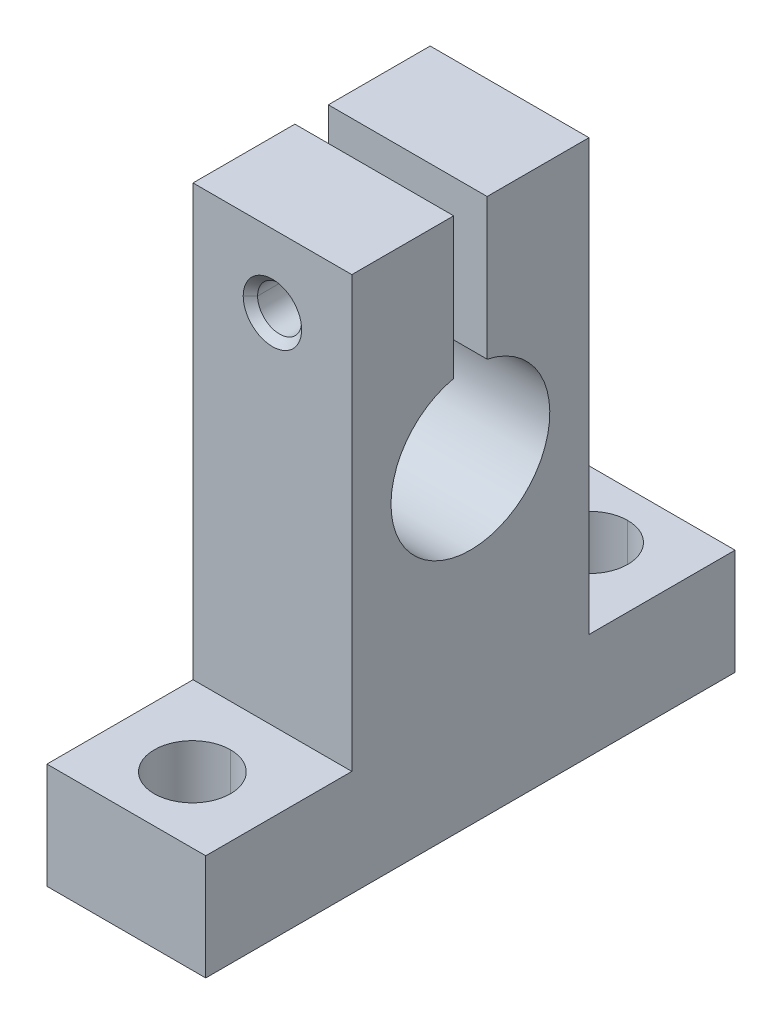
ISO-10303-21;
HEADER;
FILE_DESCRIPTION(('STEP AP214'),'2;1');
FILE_NAME('part.step','',(''),(''),'','','');
FILE_SCHEMA(('AUTOMOTIVE_DESIGN { 1 0 10303 214 1 1 1 1 }'));
ENDSEC;
DATA;
#1=APPLICATION_CONTEXT('core data for automotive mechanical design processes');
#2=APPLICATION_PROTOCOL_DEFINITION('international standard','automotive_design',2000,#1);
#3=PRODUCT_CONTEXT('',#1,'mechanical');
#4=PRODUCT('Part','Part','',(#3));
#5=PRODUCT_RELATED_PRODUCT_CATEGORY('part','',(#4));
#6=PRODUCT_DEFINITION_FORMATION('','',#4);
#7=PRODUCT_DEFINITION_CONTEXT('part definition',#1,'design');
#8=PRODUCT_DEFINITION('design','',#6,#7);
#9=PRODUCT_DEFINITION_SHAPE('','',#8);
#10=(LENGTH_UNIT() NAMED_UNIT(*) SI_UNIT(.MILLI.,.METRE.));
#11=(NAMED_UNIT(*) PLANE_ANGLE_UNIT() SI_UNIT($,.RADIAN.));
#12=(NAMED_UNIT(*) SI_UNIT($,.STERADIAN.) SOLID_ANGLE_UNIT());
#13=UNCERTAINTY_MEASURE_WITH_UNIT(LENGTH_MEASURE(1.E-05),#10,'distance_accuracy_value','');
#14=(GEOMETRIC_REPRESENTATION_CONTEXT(3) GLOBAL_UNCERTAINTY_ASSIGNED_CONTEXT((#13)) GLOBAL_UNIT_ASSIGNED_CONTEXT((#10,
#11,#12)) REPRESENTATION_CONTEXT('',''));
#15=CARTESIAN_POINT('',(0.,0.,0.));
#16=DIRECTION('',(0.,0.,1.));
#17=DIRECTION('',(1.,0.,0.));
#18=AXIS2_PLACEMENT_3D('',#15,#16,#17);
#19=CARTESIAN_POINT('',(4.7625,-12.7,15.875));
#20=DIRECTION('',(0.,0.,-1.));
#21=DIRECTION('',(-1.,0.,0.));
#22=AXIS2_PLACEMENT_3D('',#19,#20,#21);
#23=PLANE('',#22);
#24=DIRECTION('',(0.,-1.,0.));
#25=VECTOR('',#24,1.);
#26=CARTESIAN_POINT('',(-4.7625,-12.7,15.875));
#27=LINE('',#26,#25);
#28=CARTESIAN_POINT('',(-4.7625,-12.7,15.875));
#29=VERTEX_POINT('',#28);
#30=CARTESIAN_POINT('',(-4.7625,-19.05,15.875));
#31=VERTEX_POINT('',#30);
#32=EDGE_CURVE('E11',#29,#31,#27,.T.);
#33=ORIENTED_EDGE('',*,*,#32,.T.);
#34=DIRECTION('',(-1.,0.,0.));
#35=VECTOR('',#34,1.);
#36=CARTESIAN_POINT('',(4.7625,-19.05,15.875));
#37=LINE('',#36,#35);
#38=CARTESIAN_POINT('',(4.7625,-19.05,15.875));
#39=VERTEX_POINT('',#38);
#40=EDGE_CURVE('E25',#39,#31,#37,.T.);
#41=ORIENTED_EDGE('',*,*,#40,.F.);
#42=DIRECTION('',(0.,-1.,0.));
#43=VECTOR('',#42,1.);
#44=CARTESIAN_POINT('',(4.7625,-12.7,15.875));
#45=LINE('',#44,#43);
#46=CARTESIAN_POINT('',(4.7625,-12.7,15.875));
#47=VERTEX_POINT('',#46);
#48=EDGE_CURVE('E519',#47,#39,#45,.T.);
#49=ORIENTED_EDGE('',*,*,#48,.F.);
#50=DIRECTION('',(-1.,0.,0.));
#51=VECTOR('',#50,1.);
#52=CARTESIAN_POINT('',(4.7625,-12.7,15.875));
#53=LINE('',#52,#51);
#54=EDGE_CURVE('E515',#47,#29,#53,.T.);
#55=ORIENTED_EDGE('',*,*,#54,.T.);
#56=EDGE_LOOP('',(#33,#41,#49,#55));
#57=FACE_BOUND('',#56,.T.);
#58=ADVANCED_FACE('F17',(#57),#23,.F.);
#59=CARTESIAN_POINT('',(4.7625,-12.7,7.112));
#60=DIRECTION('',(0.,-1.,0.));
#61=DIRECTION('',(0.,0.,-1.));
#62=AXIS2_PLACEMENT_3D('',#59,#60,#61);
#63=PLANE('',#62);
#64=CARTESIAN_POINT('',(0.,-12.7,11.9126));
#65=DIRECTION('',(0.,1.,0.));
#66=DIRECTION('',(1.,0.,0.));
#67=AXIS2_PLACEMENT_3D('',#64,#65,#66);
#68=CIRCLE('',#67,2.286);
#69=CARTESIAN_POINT('',(0.,-12.7,9.6266));
#70=VERTEX_POINT('',#69);
#71=CARTESIAN_POINT('',(0.,-12.7,14.1986));
#72=VERTEX_POINT('',#71);
#73=EDGE_CURVE('E510',#70,#72,#68,.T.);
#74=ORIENTED_EDGE('',*,*,#73,.F.);
#75=CARTESIAN_POINT('',(0.,-12.7,11.9126));
#76=DIRECTION('',(0.,1.,0.));
#77=DIRECTION('',(0.,0.,1.));
#78=AXIS2_PLACEMENT_3D('',#75,#76,#77);
#79=CIRCLE('',#78,2.286);
#80=EDGE_CURVE('E505',#72,#70,#79,.T.);
#81=ORIENTED_EDGE('',*,*,#80,.F.);
#82=EDGE_LOOP('',(#74,#81));
#83=FACE_BOUND('',#82,.T.);
#84=DIRECTION('',(0.,0.,1.));
#85=VECTOR('',#84,1.);
#86=CARTESIAN_POINT('',(-4.7625,-12.7,7.112));
#87=LINE('',#86,#85);
#88=CARTESIAN_POINT('',(-4.7625,-12.7,7.112));
#89=VERTEX_POINT('',#88);
#90=EDGE_CURVE('E500',#89,#29,#87,.T.);
#91=ORIENTED_EDGE('',*,*,#90,.T.);
#92=ORIENTED_EDGE('',*,*,#54,.F.);
#93=DIRECTION('',(0.,0.,1.));
#94=VECTOR('',#93,1.);
#95=CARTESIAN_POINT('',(4.7625,-12.7,7.112));
#96=LINE('',#95,#94);
#97=CARTESIAN_POINT('',(4.7625,-12.7,7.112));
#98=VERTEX_POINT('',#97);
#99=EDGE_CURVE('E495',#98,#47,#96,.T.);
#100=ORIENTED_EDGE('',*,*,#99,.F.);
#101=DIRECTION('',(-1.,0.,0.));
#102=VECTOR('',#101,1.);
#103=CARTESIAN_POINT('',(4.7625,-12.7,7.112));
#104=LINE('',#103,#102);
#105=EDGE_CURVE('E491',#98,#89,#104,.T.);
#106=ORIENTED_EDGE('',*,*,#105,.T.);
#107=EDGE_LOOP('',(#91,#92,#100,#106));
#108=FACE_BOUND('',#107,.T.);
#109=ADVANCED_FACE('F537',(#83,#108),#63,.F.);
#110=CARTESIAN_POINT('',(4.7625,13.1064,7.112));
#111=DIRECTION('',(0.,0.,-1.));
#112=DIRECTION('',(-1.,0.,0.));
#113=AXIS2_PLACEMENT_3D('',#110,#111,#112);
#114=PLANE('',#113);
#115=CARTESIAN_POINT('',(0.,8.7376,7.112));
#116=DIRECTION('',(0.,0.,-1.));
#117=DIRECTION('',(-1.,0.,0.));
#118=AXIS2_PLACEMENT_3D('',#115,#116,#117);
#119=CIRCLE('',#118,1.7526);
#120=CARTESIAN_POINT('',(-1.7526,8.7376,7.112));
#121=VERTEX_POINT('',#120);
#122=CARTESIAN_POINT('',(1.7526,8.7376,7.112));
#123=VERTEX_POINT('',#122);
#124=EDGE_CURVE('E487',#121,#123,#119,.T.);
#125=ORIENTED_EDGE('',*,*,#124,.T.);
#126=CARTESIAN_POINT('',(0.,8.7376,7.112));
#127=DIRECTION('',(0.,0.,-1.));
#128=DIRECTION('',(-1.,0.,0.));
#129=AXIS2_PLACEMENT_3D('',#126,#127,#128);
#130=CIRCLE('',#129,1.7526);
#131=EDGE_CURVE('E204',#123,#121,#130,.T.);
#132=ORIENTED_EDGE('',*,*,#131,.T.);
#133=EDGE_LOOP('',(#125,#132));
#134=FACE_BOUND('',#133,.T.);
#135=DIRECTION('',(0.,-1.,0.));
#136=VECTOR('',#135,1.);
#137=CARTESIAN_POINT('',(-4.7625,13.1064,7.112));
#138=LINE('',#137,#136);
#139=CARTESIAN_POINT('',(-4.7625,13.1064,7.112));
#140=VERTEX_POINT('',#139);
#141=EDGE_CURVE('E479',#140,#89,#138,.T.);
#142=ORIENTED_EDGE('',*,*,#141,.T.);
#143=ORIENTED_EDGE('',*,*,#105,.F.);
#144=DIRECTION('',(0.,-1.,0.));
#145=VECTOR('',#144,1.);
#146=CARTESIAN_POINT('',(4.7625,13.1064,7.112));
#147=LINE('',#146,#145);
#148=CARTESIAN_POINT('',(4.7625,13.1064,7.112));
#149=VERTEX_POINT('',#148);
#150=EDGE_CURVE('E474',#149,#98,#147,.T.);
#151=ORIENTED_EDGE('',*,*,#150,.F.);
#152=DIRECTION('',(-1.,0.,0.));
#153=VECTOR('',#152,1.);
#154=CARTESIAN_POINT('',(4.7625,13.1064,7.112));
#155=LINE('',#154,#153);
#156=EDGE_CURVE('E470',#149,#140,#155,.T.);
#157=ORIENTED_EDGE('',*,*,#156,.T.);
#158=EDGE_LOOP('',(#142,#143,#151,#157));
#159=FACE_BOUND('',#158,.T.);
#160=ADVANCED_FACE('F575',(#134,#159),#114,.F.);
#161=CARTESIAN_POINT('',(4.7625,13.1064,1.0033));
#162=DIRECTION('',(0.,-1.,0.));
#163=DIRECTION('',(0.,0.,-1.));
#164=AXIS2_PLACEMENT_3D('',#161,#162,#163);
#165=PLANE('',#164);
#166=DIRECTION('',(0.,0.,1.));
#167=VECTOR('',#166,1.);
#168=CARTESIAN_POINT('',(-4.7625,13.1064,1.0033));
#169=LINE('',#168,#167);
#170=CARTESIAN_POINT('',(-4.7625,13.1064,1.0033));
#171=VERTEX_POINT('',#170);
#172=EDGE_CURVE('E465',#171,#140,#169,.T.);
#173=ORIENTED_EDGE('',*,*,#172,.T.);
#174=ORIENTED_EDGE('',*,*,#156,.F.);
#175=DIRECTION('',(0.,0.,1.));
#176=VECTOR('',#175,1.);
#177=CARTESIAN_POINT('',(4.7625,13.1064,1.0033));
#178=LINE('',#177,#176);
#179=CARTESIAN_POINT('',(4.7625,13.1064,1.0033));
#180=VERTEX_POINT('',#179);
#181=EDGE_CURVE('E460',#180,#149,#178,.T.);
#182=ORIENTED_EDGE('',*,*,#181,.F.);
#183=DIRECTION('',(-1.,0.,0.));
#184=VECTOR('',#183,1.);
#185=CARTESIAN_POINT('',(4.7625,13.1064,1.0033));
#186=LINE('',#185,#184);
#187=EDGE_CURVE('E456',#180,#171,#186,.T.);
#188=ORIENTED_EDGE('',*,*,#187,.T.);
#189=EDGE_LOOP('',(#173,#174,#182,#188));
#190=FACE_BOUND('',#189,.T.);
#191=ADVANCED_FACE('F573',(#190),#165,.F.);
#192=CARTESIAN_POINT('',(4.7625,4.6556197611059,1.0033));
#193=DIRECTION('',(0.,0.,1.));
#194=DIRECTION('',(1.,0.,0.));
#195=AXIS2_PLACEMENT_3D('',#192,#193,#194);
#196=PLANE('',#195);
#197=CARTESIAN_POINT('',(0.,8.7376,1.0033));
#198=DIRECTION('',(0.,0.,-1.));
#199=DIRECTION('',(-1.,0.,0.));
#200=AXIS2_PLACEMENT_3D('',#197,#198,#199);
#201=CIRCLE('',#200,1.7526);
#202=CARTESIAN_POINT('',(1.7526,8.7376,1.0033));
#203=VERTEX_POINT('',#202);
#204=CARTESIAN_POINT('',(-1.7526,8.7376,1.0033));
#205=VERTEX_POINT('',#204);
#206=EDGE_CURVE('E451',#203,#205,#201,.T.);
#207=ORIENTED_EDGE('',*,*,#206,.F.);
#208=CARTESIAN_POINT('',(0.,8.7376,1.0033));
#209=DIRECTION('',(0.,0.,-1.));
#210=DIRECTION('',(-1.,0.,0.));
#211=AXIS2_PLACEMENT_3D('',#208,#209,#210);
#212=CIRCLE('',#211,1.7526);
#213=EDGE_CURVE('E446',#205,#203,#212,.T.);
#214=ORIENTED_EDGE('',*,*,#213,.F.);
#215=EDGE_LOOP('',(#207,#214));
#216=FACE_BOUND('',#215,.T.);
#217=DIRECTION('',(0.,1.,0.));
#218=VECTOR('',#217,1.);
#219=CARTESIAN_POINT('',(-4.7625,4.6556197611059,1.0033));
#220=LINE('',#219,#218);
#221=CARTESIAN_POINT('',(-4.7625,4.6556197611059,1.0033));
#222=VERTEX_POINT('',#221);
#223=EDGE_CURVE('E441',#222,#171,#220,.T.);
#224=ORIENTED_EDGE('',*,*,#223,.T.);
#225=ORIENTED_EDGE('',*,*,#187,.F.);
#226=DIRECTION('',(0.,1.,0.));
#227=VECTOR('',#226,1.);
#228=CARTESIAN_POINT('',(4.7625,4.6556197611059,1.0033));
#229=LINE('',#228,#227);
#230=CARTESIAN_POINT('',(4.7625,4.6556197611059,1.0033));
#231=VERTEX_POINT('',#230);
#232=EDGE_CURVE('E436',#231,#180,#229,.T.);
#233=ORIENTED_EDGE('',*,*,#232,.F.);
#234=DIRECTION('',(-1.,0.,0.));
#235=VECTOR('',#234,1.);
#236=CARTESIAN_POINT('',(4.7625,4.6556197611059,1.0033));
#237=LINE('',#236,#235);
#238=EDGE_CURVE('E432',#231,#222,#237,.T.);
#239=ORIENTED_EDGE('',*,*,#238,.T.);
#240=EDGE_LOOP('',(#224,#225,#233,#239));
#241=FACE_BOUND('',#240,.T.);
#242=ADVANCED_FACE('F568',(#216,#241),#196,.F.);
#243=CARTESIAN_POINT('',(4.7625,0.,0.));
#244=DIRECTION('',(-1.,0.,0.));
#245=DIRECTION('',(0.,1.,0.));
#246=AXIS2_PLACEMENT_3D('',#243,#244,#245);
#247=CYLINDRICAL_SURFACE('',#246,4.7625);
#248=CARTESIAN_POINT('',(-4.7625,0.,0.));
#249=DIRECTION('',(1.,0.,0.));
#250=DIRECTION('',(0.,0.,-1.));
#251=AXIS2_PLACEMENT_3D('',#248,#249,#250);
#252=CIRCLE('',#251,4.7625);
#253=CARTESIAN_POINT('',(-4.7625,4.6556197611059,-1.0033));
#254=VERTEX_POINT('',#253);
#255=EDGE_CURVE('E427',#222,#254,#252,.T.);
#256=ORIENTED_EDGE('',*,*,#255,.F.);
#257=ORIENTED_EDGE('',*,*,#238,.F.);
#258=CARTESIAN_POINT('',(4.7625,0.,0.));
#259=DIRECTION('',(1.,0.,0.));
#260=DIRECTION('',(0.,0.,-1.));
#261=AXIS2_PLACEMENT_3D('',#258,#259,#260);
#262=CIRCLE('',#261,4.7625);
#263=CARTESIAN_POINT('',(4.7625,4.6556197611059,-1.0033));
#264=VERTEX_POINT('',#263);
#265=EDGE_CURVE('E423',#231,#264,#262,.T.);
#266=ORIENTED_EDGE('',*,*,#265,.T.);
#267=DIRECTION('',(-1.,0.,0.));
#268=VECTOR('',#267,1.);
#269=CARTESIAN_POINT('',(4.7625,4.6556197611059,-1.0033));
#270=LINE('',#269,#268);
#271=EDGE_CURVE('E419',#264,#254,#270,.T.);
#272=ORIENTED_EDGE('',*,*,#271,.T.);
#273=EDGE_LOOP('',(#256,#257,#266,#272));
#274=FACE_BOUND('',#273,.T.);
#275=ADVANCED_FACE('F565',(#274),#247,.F.);
#276=CARTESIAN_POINT('',(4.7625,13.1064,-1.0033));
#277=DIRECTION('',(0.,0.,-1.));
#278=DIRECTION('',(-1.,0.,0.));
#279=AXIS2_PLACEMENT_3D('',#276,#277,#278);
#280=PLANE('',#279);
#281=CARTESIAN_POINT('',(0.,8.7376,-1.0033));
#282=DIRECTION('',(0.,0.,-1.));
#283=DIRECTION('',(-1.,0.,0.));
#284=AXIS2_PLACEMENT_3D('',#281,#282,#283);
#285=CIRCLE('',#284,1.9558);
#286=CARTESIAN_POINT('',(-1.9558,8.7376,-1.0033));
#287=VERTEX_POINT('',#286);
#288=CARTESIAN_POINT('',(1.9558,8.7376,-1.0033));
#289=VERTEX_POINT('',#288);
#290=EDGE_CURVE('E415',#287,#289,#285,.T.);
#291=ORIENTED_EDGE('',*,*,#290,.T.);
#292=CARTESIAN_POINT('',(0.,8.7376,-1.0033));
#293=DIRECTION('',(0.,0.,-1.));
#294=DIRECTION('',(-1.,0.,0.));
#295=AXIS2_PLACEMENT_3D('',#292,#293,#294);
#296=CIRCLE('',#295,1.9558);
#297=EDGE_CURVE('E411',#289,#287,#296,.T.);
#298=ORIENTED_EDGE('',*,*,#297,.T.);
#299=EDGE_LOOP('',(#291,#298));
#300=FACE_BOUND('',#299,.T.);
#301=DIRECTION('',(0.,-1.,0.));
#302=VECTOR('',#301,1.);
#303=CARTESIAN_POINT('',(-4.7625,13.1064,-1.0033));
#304=LINE('',#303,#302);
#305=CARTESIAN_POINT('',(-4.7625,13.1064,-1.0033));
#306=VERTEX_POINT('',#305);
#307=EDGE_CURVE('E406',#306,#254,#304,.T.);
#308=ORIENTED_EDGE('',*,*,#307,.T.);
#309=ORIENTED_EDGE('',*,*,#271,.F.);
#310=DIRECTION('',(0.,-1.,0.));
#311=VECTOR('',#310,1.);
#312=CARTESIAN_POINT('',(4.7625,13.1064,-1.0033));
#313=LINE('',#312,#311);
#314=CARTESIAN_POINT('',(4.7625,13.1064,-1.0033));
#315=VERTEX_POINT('',#314);
#316=EDGE_CURVE('E401',#315,#264,#313,.T.);
#317=ORIENTED_EDGE('',*,*,#316,.F.);
#318=DIRECTION('',(-1.,0.,0.));
#319=VECTOR('',#318,1.);
#320=CARTESIAN_POINT('',(4.7625,13.1064,-1.0033));
#321=LINE('',#320,#319);
#322=EDGE_CURVE('E397',#315,#306,#321,.T.);
#323=ORIENTED_EDGE('',*,*,#322,.T.);
#324=EDGE_LOOP('',(#308,#309,#317,#323));
#325=FACE_BOUND('',#324,.T.);
#326=ADVANCED_FACE('F562',(#300,#325),#280,.F.);
#327=CARTESIAN_POINT('',(4.7625,13.1064,-7.112));
#328=DIRECTION('',(0.,-1.,0.));
#329=DIRECTION('',(0.,0.,-1.));
#330=AXIS2_PLACEMENT_3D('',#327,#328,#329);
#331=PLANE('',#330);
#332=DIRECTION('',(0.,0.,1.));
#333=VECTOR('',#332,1.);
#334=CARTESIAN_POINT('',(-4.7625,13.1064,-7.112));
#335=LINE('',#334,#333);
#336=CARTESIAN_POINT('',(-4.7625,13.1064,-7.112));
#337=VERTEX_POINT('',#336);
#338=EDGE_CURVE('E392',#337,#306,#335,.T.);
#339=ORIENTED_EDGE('',*,*,#338,.T.);
#340=ORIENTED_EDGE('',*,*,#322,.F.);
#341=DIRECTION('',(0.,0.,1.));
#342=VECTOR('',#341,1.);
#343=CARTESIAN_POINT('',(4.7625,13.1064,-7.112));
#344=LINE('',#343,#342);
#345=CARTESIAN_POINT('',(4.7625,13.1064,-7.112));
#346=VERTEX_POINT('',#345);
#347=EDGE_CURVE('E387',#346,#315,#344,.T.);
#348=ORIENTED_EDGE('',*,*,#347,.F.);
#349=DIRECTION('',(-1.,0.,0.));
#350=VECTOR('',#349,1.);
#351=CARTESIAN_POINT('',(4.7625,13.1064,-7.112));
#352=LINE('',#351,#350);
#353=EDGE_CURVE('E383',#346,#337,#352,.T.);
#354=ORIENTED_EDGE('',*,*,#353,.T.);
#355=EDGE_LOOP('',(#339,#340,#348,#354));
#356=FACE_BOUND('',#355,.T.);
#357=ADVANCED_FACE('F555',(#356),#331,.F.);
#358=CARTESIAN_POINT('',(4.7625,-12.7,-7.112));
#359=DIRECTION('',(0.,0.,1.));
#360=DIRECTION('',(1.,0.,0.));
#361=AXIS2_PLACEMENT_3D('',#358,#359,#360);
#362=PLANE('',#361);
#363=CARTESIAN_POINT('',(0.,8.7376,-7.112));
#364=DIRECTION('',(0.,0.,-1.));
#365=DIRECTION('',(-1.,0.,0.));
#366=AXIS2_PLACEMENT_3D('',#363,#364,#365);
#367=CIRCLE('',#366,3.5687);
#368=CARTESIAN_POINT('',(3.5687,8.7376,-7.112));
#369=VERTEX_POINT('',#368);
#370=CARTESIAN_POINT('',(-3.5687,8.7376,-7.112));
#371=VERTEX_POINT('',#370);
#372=EDGE_CURVE('E378',#369,#371,#367,.T.);
#373=ORIENTED_EDGE('',*,*,#372,.F.);
#374=CARTESIAN_POINT('',(0.,8.7376,-7.112));
#375=DIRECTION('',(0.,0.,-1.));
#376=DIRECTION('',(-1.,0.,0.));
#377=AXIS2_PLACEMENT_3D('',#374,#375,#376);
#378=CIRCLE('',#377,3.5687);
#379=EDGE_CURVE('E373',#371,#369,#378,.T.);
#380=ORIENTED_EDGE('',*,*,#379,.F.);
#381=EDGE_LOOP('',(#373,#380));
#382=FACE_BOUND('',#381,.T.);
#383=DIRECTION('',(0.,1.,0.));
#384=VECTOR('',#383,1.);
#385=CARTESIAN_POINT('',(-4.7625,-12.7,-7.112));
#386=LINE('',#385,#384);
#387=CARTESIAN_POINT('',(-4.7625,-12.7,-7.112));
#388=VERTEX_POINT('',#387);
#389=EDGE_CURVE('E368',#388,#337,#386,.T.);
#390=ORIENTED_EDGE('',*,*,#389,.T.);
#391=ORIENTED_EDGE('',*,*,#353,.F.);
#392=DIRECTION('',(0.,1.,0.));
#393=VECTOR('',#392,1.);
#394=CARTESIAN_POINT('',(4.7625,-12.7,-7.112));
#395=LINE('',#394,#393);
#396=CARTESIAN_POINT('',(4.7625,-12.7,-7.112));
#397=VERTEX_POINT('',#396);
#398=EDGE_CURVE('E363',#397,#346,#395,.T.);
#399=ORIENTED_EDGE('',*,*,#398,.F.);
#400=DIRECTION('',(-1.,0.,0.));
#401=VECTOR('',#400,1.);
#402=CARTESIAN_POINT('',(4.7625,-12.7,-7.112));
#403=LINE('',#402,#401);
#404=EDGE_CURVE('E359',#397,#388,#403,.T.);
#405=ORIENTED_EDGE('',*,*,#404,.T.);
#406=EDGE_LOOP('',(#390,#391,#399,#405));
#407=FACE_BOUND('',#406,.T.);
#408=ADVANCED_FACE('F552',(#382,#407),#362,.F.);
#409=CARTESIAN_POINT('',(4.7625,-12.7,-15.875));
#410=DIRECTION('',(0.,-1.,0.));
#411=DIRECTION('',(0.,0.,-1.));
#412=AXIS2_PLACEMENT_3D('',#409,#410,#411);
#413=PLANE('',#412);
#414=CARTESIAN_POINT('',(0.,-12.7,-11.9126));
#415=DIRECTION('',(0.,1.,0.));
#416=DIRECTION('',(1.,0.,0.));
#417=AXIS2_PLACEMENT_3D('',#414,#415,#416);
#418=CIRCLE('',#417,2.286);
#419=CARTESIAN_POINT('',(0.,-12.7,-14.1986));
#420=VERTEX_POINT('',#419);
#421=CARTESIAN_POINT('',(0.,-12.7,-9.6266));
#422=VERTEX_POINT('',#421);
#423=EDGE_CURVE('E354',#420,#422,#418,.T.);
#424=ORIENTED_EDGE('',*,*,#423,.F.);
#425=CARTESIAN_POINT('',(0.,-12.7,-11.9126));
#426=DIRECTION('',(0.,1.,0.));
#427=DIRECTION('',(0.,0.,1.));
#428=AXIS2_PLACEMENT_3D('',#425,#426,#427);
#429=CIRCLE('',#428,2.286);
#430=EDGE_CURVE('E349',#422,#420,#429,.T.);
#431=ORIENTED_EDGE('',*,*,#430,.F.);
#432=EDGE_LOOP('',(#424,#431));
#433=FACE_BOUND('',#432,.T.);
#434=DIRECTION('',(0.,0.,1.));
#435=VECTOR('',#434,1.);
#436=CARTESIAN_POINT('',(-4.7625,-12.7,-15.875));
#437=LINE('',#436,#435);
#438=CARTESIAN_POINT('',(-4.7625,-12.7,-15.875));
#439=VERTEX_POINT('',#438);
#440=EDGE_CURVE('E344',#439,#388,#437,.T.);
#441=ORIENTED_EDGE('',*,*,#440,.T.);
#442=ORIENTED_EDGE('',*,*,#404,.F.);
#443=DIRECTION('',(0.,0.,1.));
#444=VECTOR('',#443,1.);
#445=CARTESIAN_POINT('',(4.7625,-12.7,-15.875));
#446=LINE('',#445,#444);
#447=CARTESIAN_POINT('',(4.7625,-12.7,-15.875));
#448=VERTEX_POINT('',#447);
#449=EDGE_CURVE('E339',#448,#397,#446,.T.);
#450=ORIENTED_EDGE('',*,*,#449,.F.);
#451=DIRECTION('',(-1.,0.,0.));
#452=VECTOR('',#451,1.);
#453=CARTESIAN_POINT('',(4.7625,-12.7,-15.875));
#454=LINE('',#453,#452);
#455=EDGE_CURVE('E335',#448,#439,#454,.T.);
#456=ORIENTED_EDGE('',*,*,#455,.T.);
#457=EDGE_LOOP('',(#441,#442,#450,#456));
#458=FACE_BOUND('',#457,.T.);
#459=ADVANCED_FACE('F550',(#433,#458),#413,.F.);
#460=CARTESIAN_POINT('',(4.7625,-19.05,-15.875));
#461=DIRECTION('',(0.,0.,1.));
#462=DIRECTION('',(1.,0.,0.));
#463=AXIS2_PLACEMENT_3D('',#460,#461,#462);
#464=PLANE('',#463);
#465=DIRECTION('',(0.,1.,0.));
#466=VECTOR('',#465,1.);
#467=CARTESIAN_POINT('',(-4.7625,-19.05,-15.875));
#468=LINE('',#467,#466);
#469=CARTESIAN_POINT('',(-4.7625,-19.05,-15.875));
#470=VERTEX_POINT('',#469);
#471=EDGE_CURVE('E330',#470,#439,#468,.T.);
#472=ORIENTED_EDGE('',*,*,#471,.T.);
#473=ORIENTED_EDGE('',*,*,#455,.F.);
#474=DIRECTION('',(0.,1.,0.));
#475=VECTOR('',#474,1.);
#476=CARTESIAN_POINT('',(4.7625,-19.05,-15.875));
#477=LINE('',#476,#475);
#478=CARTESIAN_POINT('',(4.7625,-19.05,-15.875));
#479=VERTEX_POINT('',#478);
#480=EDGE_CURVE('E325',#479,#448,#477,.T.);
#481=ORIENTED_EDGE('',*,*,#480,.F.);
#482=DIRECTION('',(-1.,0.,0.));
#483=VECTOR('',#482,1.);
#484=CARTESIAN_POINT('',(4.7625,-19.05,-15.875));
#485=LINE('',#484,#483);
#486=EDGE_CURVE('E321',#479,#470,#485,.T.);
#487=ORIENTED_EDGE('',*,*,#486,.T.);
#488=EDGE_LOOP('',(#472,#473,#481,#487));
#489=FACE_BOUND('',#488,.T.);
#490=ADVANCED_FACE('F546',(#489),#464,.F.);
#491=CARTESIAN_POINT('',(4.7625,-19.05,15.875));
#492=DIRECTION('',(0.,1.,0.));
#493=DIRECTION('',(0.,0.,1.));
#494=AXIS2_PLACEMENT_3D('',#491,#492,#493);
#495=PLANE('',#494);
#496=CARTESIAN_POINT('',(0.,-19.05,11.9126));
#497=DIRECTION('',(0.,1.,0.));
#498=DIRECTION('',(1.,0.,0.));
#499=AXIS2_PLACEMENT_3D('',#496,#497,#498);
#500=CIRCLE('',#499,2.286);
#501=CARTESIAN_POINT('',(0.,-19.05,9.6266));
#502=VERTEX_POINT('',#501);
#503=CARTESIAN_POINT('',(0.,-19.05,14.1986));
#504=VERTEX_POINT('',#503);
#505=EDGE_CURVE('E317',#502,#504,#500,.T.);
#506=ORIENTED_EDGE('',*,*,#505,.T.);
#507=CARTESIAN_POINT('',(0.,-19.05,11.9126));
#508=DIRECTION('',(0.,1.,0.));
#509=DIRECTION('',(0.,0.,1.));
#510=AXIS2_PLACEMENT_3D('',#507,#508,#509);
#511=CIRCLE('',#510,2.286);
#512=EDGE_CURVE('E313',#504,#502,#511,.T.);
#513=ORIENTED_EDGE('',*,*,#512,.T.);
#514=EDGE_LOOP('',(#506,#513));
#515=FACE_BOUND('',#514,.T.);
#516=CARTESIAN_POINT('',(0.,-19.05,-11.9126));
#517=DIRECTION('',(0.,1.,0.));
#518=DIRECTION('',(1.,0.,0.));
#519=AXIS2_PLACEMENT_3D('',#516,#517,#518);
#520=CIRCLE('',#519,2.286);
#521=CARTESIAN_POINT('',(0.,-19.05,-14.1986));
#522=VERTEX_POINT('',#521);
#523=CARTESIAN_POINT('',(0.,-19.05,-9.6266));
#524=VERTEX_POINT('',#523);
#525=EDGE_CURVE('E309',#522,#524,#520,.T.);
#526=ORIENTED_EDGE('',*,*,#525,.T.);
#527=CARTESIAN_POINT('',(0.,-19.05,-11.9126));
#528=DIRECTION('',(0.,1.,0.));
#529=DIRECTION('',(0.,0.,1.));
#530=AXIS2_PLACEMENT_3D('',#527,#528,#529);
#531=CIRCLE('',#530,2.286);
#532=EDGE_CURVE('E305',#524,#522,#531,.T.);
#533=ORIENTED_EDGE('',*,*,#532,.T.);
#534=EDGE_LOOP('',(#526,#533));
#535=FACE_BOUND('',#534,.T.);
#536=DIRECTION('',(0.,0.,-1.));
#537=VECTOR('',#536,1.);
#538=CARTESIAN_POINT('',(-4.7625,-19.05,15.875));
#539=LINE('',#538,#537);
#540=EDGE_CURVE('E300',#31,#470,#539,.T.);
#541=ORIENTED_EDGE('',*,*,#540,.T.);
#542=ORIENTED_EDGE('',*,*,#486,.F.);
#543=DIRECTION('',(0.,0.,-1.));
#544=VECTOR('',#543,1.);
#545=CARTESIAN_POINT('',(4.7625,-19.05,15.875));
#546=LINE('',#545,#544);
#547=EDGE_CURVE('E295',#39,#479,#546,.T.);
#548=ORIENTED_EDGE('',*,*,#547,.F.);
#549=ORIENTED_EDGE('',*,*,#40,.T.);
#550=EDGE_LOOP('',(#541,#542,#548,#549));
#551=FACE_BOUND('',#550,.T.);
#552=ADVANCED_FACE('F529',(#515,#535,#551),#495,.F.);
#553=CARTESIAN_POINT('',(4.7625,0.,0.));
#554=DIRECTION('',(1.,0.,0.));
#555=DIRECTION('',(0.,0.,-1.));
#556=AXIS2_PLACEMENT_3D('',#553,#554,#555);
#557=PLANE('',#556);
#558=ORIENTED_EDGE('',*,*,#48,.T.);
#559=ORIENTED_EDGE('',*,*,#547,.T.);
#560=ORIENTED_EDGE('',*,*,#480,.T.);
#561=ORIENTED_EDGE('',*,*,#449,.T.);
#562=ORIENTED_EDGE('',*,*,#398,.T.);
#563=ORIENTED_EDGE('',*,*,#347,.T.);
#564=ORIENTED_EDGE('',*,*,#316,.T.);
#565=ORIENTED_EDGE('',*,*,#265,.F.);
#566=ORIENTED_EDGE('',*,*,#232,.T.);
#567=ORIENTED_EDGE('',*,*,#181,.T.);
#568=ORIENTED_EDGE('',*,*,#150,.T.);
#569=ORIENTED_EDGE('',*,*,#99,.T.);
#570=EDGE_LOOP('',(#558,#559,#560,#561,#562,#563,#564,#565,#566,#567,#568,#569));
#571=FACE_BOUND('',#570,.T.);
#572=ADVANCED_FACE('F533',(#571),#557,.T.);
#573=CARTESIAN_POINT('',(-4.7625,0.,0.));
#574=DIRECTION('',(1.,0.,0.));
#575=DIRECTION('',(0.,0.,-1.));
#576=AXIS2_PLACEMENT_3D('',#573,#574,#575);
#577=PLANE('',#576);
#578=ORIENTED_EDGE('',*,*,#32,.F.);
#579=ORIENTED_EDGE('',*,*,#90,.F.);
#580=ORIENTED_EDGE('',*,*,#141,.F.);
#581=ORIENTED_EDGE('',*,*,#172,.F.);
#582=ORIENTED_EDGE('',*,*,#223,.F.);
#583=ORIENTED_EDGE('',*,*,#255,.T.);
#584=ORIENTED_EDGE('',*,*,#307,.F.);
#585=ORIENTED_EDGE('',*,*,#338,.F.);
#586=ORIENTED_EDGE('',*,*,#389,.F.);
#587=ORIENTED_EDGE('',*,*,#440,.F.);
#588=ORIENTED_EDGE('',*,*,#471,.F.);
#589=ORIENTED_EDGE('',*,*,#540,.F.);
#590=EDGE_LOOP('',(#578,#579,#580,#581,#582,#583,#584,#585,#586,#587,#588,#589));
#591=FACE_BOUND('',#590,.T.);
#592=ADVANCED_FACE('F541',(#591),#577,.F.);
#593=CARTESIAN_POINT('',(0.,-12.7,-11.9126));
#594=DIRECTION('',(0.,-1.,0.));
#595=DIRECTION('',(-1.,0.,0.));
#596=AXIS2_PLACEMENT_3D('',#593,#594,#595);
#597=CYLINDRICAL_SURFACE('',#596,2.286);
#598=DIRECTION('',(0.,-1.,0.));
#599=VECTOR('',#598,1.);
#600=CARTESIAN_POINT('',(0.,-12.7,-9.6266));
#601=LINE('',#600,#599);
#602=EDGE_CURVE('E290',#422,#524,#601,.T.);
#603=ORIENTED_EDGE('',*,*,#602,.F.);
#604=ORIENTED_EDGE('',*,*,#430,.T.);
#605=DIRECTION('',(0.,-1.,0.));
#606=VECTOR('',#605,1.);
#607=CARTESIAN_POINT('',(0.,-12.7,-14.1986));
#608=LINE('',#607,#606);
#609=EDGE_CURVE('E285',#420,#522,#608,.T.);
#610=ORIENTED_EDGE('',*,*,#609,.T.);
#611=ORIENTED_EDGE('',*,*,#532,.F.);
#612=EDGE_LOOP('',(#603,#604,#610,#611));
#613=FACE_BOUND('',#612,.T.);
#614=ADVANCED_FACE('F706',(#613),#597,.F.);
#615=CARTESIAN_POINT('',(0.,-12.7,-11.9126));
#616=DIRECTION('',(0.,-1.,0.));
#617=DIRECTION('',(1.,0.,0.));
#618=AXIS2_PLACEMENT_3D('',#615,#616,#617);
#619=CYLINDRICAL_SURFACE('',#618,2.286);
#620=ORIENTED_EDGE('',*,*,#602,.T.);
#621=ORIENTED_EDGE('',*,*,#525,.F.);
#622=ORIENTED_EDGE('',*,*,#609,.F.);
#623=ORIENTED_EDGE('',*,*,#423,.T.);
#624=EDGE_LOOP('',(#620,#621,#622,#623));
#625=FACE_BOUND('',#624,.T.);
#626=ADVANCED_FACE('F716',(#625),#619,.F.);
#627=CARTESIAN_POINT('',(0.,-12.7,11.9126));
#628=DIRECTION('',(0.,-1.,0.));
#629=DIRECTION('',(-1.,0.,0.));
#630=AXIS2_PLACEMENT_3D('',#627,#628,#629);
#631=CYLINDRICAL_SURFACE('',#630,2.286);
#632=DIRECTION('',(0.,-1.,0.));
#633=VECTOR('',#632,1.);
#634=CARTESIAN_POINT('',(0.,-12.7,14.1986));
#635=LINE('',#634,#633);
#636=EDGE_CURVE('E280',#72,#504,#635,.T.);
#637=ORIENTED_EDGE('',*,*,#636,.F.);
#638=ORIENTED_EDGE('',*,*,#80,.T.);
#639=DIRECTION('',(0.,-1.,0.));
#640=VECTOR('',#639,1.);
#641=CARTESIAN_POINT('',(0.,-12.7,9.6266));
#642=LINE('',#641,#640);
#643=EDGE_CURVE('E275',#70,#502,#642,.T.);
#644=ORIENTED_EDGE('',*,*,#643,.T.);
#645=ORIENTED_EDGE('',*,*,#512,.F.);
#646=EDGE_LOOP('',(#637,#638,#644,#645));
#647=FACE_BOUND('',#646,.T.);
#648=ADVANCED_FACE('F727',(#647),#631,.F.);
#649=CARTESIAN_POINT('',(0.,-12.7,11.9126));
#650=DIRECTION('',(0.,-1.,0.));
#651=DIRECTION('',(1.,0.,0.));
#652=AXIS2_PLACEMENT_3D('',#649,#650,#651);
#653=CYLINDRICAL_SURFACE('',#652,2.286);
#654=ORIENTED_EDGE('',*,*,#636,.T.);
#655=ORIENTED_EDGE('',*,*,#505,.F.);
#656=ORIENTED_EDGE('',*,*,#643,.F.);
#657=ORIENTED_EDGE('',*,*,#73,.T.);
#658=EDGE_LOOP('',(#654,#655,#656,#657));
#659=FACE_BOUND('',#658,.T.);
#660=ADVANCED_FACE('F738',(#659),#653,.F.);
#661=CARTESIAN_POINT('',(0.,8.7376,-7.112));
#662=DIRECTION('',(0.,0.,-1.));
#663=DIRECTION('',(0.,-1.,0.));
#664=AXIS2_PLACEMENT_3D('',#661,#662,#663);
#665=CYLINDRICAL_SURFACE('',#664,3.5687);
#666=DIRECTION('',(0.,0.,-1.));
#667=VECTOR('',#666,1.);
#668=CARTESIAN_POINT('',(3.5687,8.7376,-3.2004));
#669=LINE('',#668,#667);
#670=CARTESIAN_POINT('',(3.5687,8.7376,-3.2004));
#671=VERTEX_POINT('',#670);
#672=EDGE_CURVE('E270',#671,#369,#669,.T.);
#673=ORIENTED_EDGE('',*,*,#672,.F.);
#674=CARTESIAN_POINT('',(0.,8.7376,-3.2004));
#675=DIRECTION('',(0.,0.,-1.));
#676=DIRECTION('',(-1.,0.,0.));
#677=AXIS2_PLACEMENT_3D('',#674,#675,#676);
#678=CIRCLE('',#677,3.5687);
#679=CARTESIAN_POINT('',(-3.5687,8.7376,-3.2004));
#680=VERTEX_POINT('',#679);
#681=EDGE_CURVE('E265',#680,#671,#678,.T.);
#682=ORIENTED_EDGE('',*,*,#681,.F.);
#683=DIRECTION('',(0.,0.,-1.));
#684=VECTOR('',#683,1.);
#685=CARTESIAN_POINT('',(-3.5687,8.7376,-3.2004));
#686=LINE('',#685,#684);
#687=EDGE_CURVE('E260',#680,#371,#686,.T.);
#688=ORIENTED_EDGE('',*,*,#687,.T.);
#689=ORIENTED_EDGE('',*,*,#379,.T.);
#690=EDGE_LOOP('',(#673,#682,#688,#689));
#691=FACE_BOUND('',#690,.T.);
#692=ADVANCED_FACE('F749',(#691),#665,.F.);
#693=CARTESIAN_POINT('',(0.,8.7376,-7.112));
#694=DIRECTION('',(0.,0.,-1.));
#695=DIRECTION('',(0.,1.,0.));
#696=AXIS2_PLACEMENT_3D('',#693,#694,#695);
#697=CYLINDRICAL_SURFACE('',#696,3.5687);
#698=ORIENTED_EDGE('',*,*,#672,.T.);
#699=ORIENTED_EDGE('',*,*,#372,.T.);
#700=ORIENTED_EDGE('',*,*,#687,.F.);
#701=CARTESIAN_POINT('',(0.,8.7376,-3.2004));
#702=DIRECTION('',(0.,0.,-1.));
#703=DIRECTION('',(-1.,0.,0.));
#704=AXIS2_PLACEMENT_3D('',#701,#702,#703);
#705=CIRCLE('',#704,3.5687);
#706=EDGE_CURVE('E255',#671,#680,#705,.T.);
#707=ORIENTED_EDGE('',*,*,#706,.F.);
#708=EDGE_LOOP('',(#698,#699,#700,#707));
#709=FACE_BOUND('',#708,.T.);
#710=ADVANCED_FACE('F760',(#709),#697,.F.);
#711=CARTESIAN_POINT('',(0.,10.6934,-3.2004));
#712=DIRECTION('',(0.,0.,-1.));
#713=DIRECTION('',(-1.,0.,0.));
#714=AXIS2_PLACEMENT_3D('',#711,#712,#713);
#715=PLANE('',#714);
#716=ORIENTED_EDGE('',*,*,#681,.T.);
#717=ORIENTED_EDGE('',*,*,#706,.T.);
#718=EDGE_LOOP('',(#716,#717));
#719=FACE_BOUND('',#718,.T.);
#720=CARTESIAN_POINT('',(0.,8.7376,-3.2004));
#721=DIRECTION('',(0.,0.,-1.));
#722=DIRECTION('',(-1.,0.,0.));
#723=AXIS2_PLACEMENT_3D('',#720,#721,#722);
#724=CIRCLE('',#723,1.9558);
#725=CARTESIAN_POINT('',(1.9558,8.7376,-3.2004));
#726=VERTEX_POINT('',#725);
#727=CARTESIAN_POINT('',(-1.9558,8.7376,-3.2004));
#728=VERTEX_POINT('',#727);
#729=EDGE_CURVE('E250',#726,#728,#724,.T.);
#730=ORIENTED_EDGE('',*,*,#729,.F.);
#731=CARTESIAN_POINT('',(0.,8.7376,-3.2004));
#732=DIRECTION('',(0.,0.,-1.));
#733=DIRECTION('',(-1.,0.,0.));
#734=AXIS2_PLACEMENT_3D('',#731,#732,#733);
#735=CIRCLE('',#734,1.9558);
#736=EDGE_CURVE('E245',#728,#726,#735,.T.);
#737=ORIENTED_EDGE('',*,*,#736,.F.);
#738=EDGE_LOOP('',(#730,#737));
#739=FACE_BOUND('',#738,.T.);
#740=ADVANCED_FACE('F771',(#719,#739),#715,.T.);
#741=CARTESIAN_POINT('',(0.,8.7376,-7.112));
#742=DIRECTION('',(0.,0.,-1.));
#743=DIRECTION('',(0.,-1.,0.));
#744=AXIS2_PLACEMENT_3D('',#741,#742,#743);
#745=CYLINDRICAL_SURFACE('',#744,1.9558);
#746=DIRECTION('',(0.,0.,-1.));
#747=VECTOR('',#746,1.);
#748=CARTESIAN_POINT('',(1.9558,8.7376,-1.0033));
#749=LINE('',#748,#747);
#750=EDGE_CURVE('E240',#289,#726,#749,.T.);
#751=ORIENTED_EDGE('',*,*,#750,.F.);
#752=ORIENTED_EDGE('',*,*,#290,.F.);
#753=DIRECTION('',(0.,0.,-1.));
#754=VECTOR('',#753,1.);
#755=CARTESIAN_POINT('',(-1.9558,8.7376,-1.0033));
#756=LINE('',#755,#754);
#757=EDGE_CURVE('E235',#287,#728,#756,.T.);
#758=ORIENTED_EDGE('',*,*,#757,.T.);
#759=ORIENTED_EDGE('',*,*,#736,.T.);
#760=EDGE_LOOP('',(#751,#752,#758,#759));
#761=FACE_BOUND('',#760,.T.);
#762=ADVANCED_FACE('F782',(#761),#745,.F.);
#763=CARTESIAN_POINT('',(0.,8.7376,-7.112));
#764=DIRECTION('',(0.,0.,-1.));
#765=DIRECTION('',(0.,1.,0.));
#766=AXIS2_PLACEMENT_3D('',#763,#764,#765);
#767=CYLINDRICAL_SURFACE('',#766,1.9558);
#768=ORIENTED_EDGE('',*,*,#750,.T.);
#769=ORIENTED_EDGE('',*,*,#729,.T.);
#770=ORIENTED_EDGE('',*,*,#757,.F.);
#771=ORIENTED_EDGE('',*,*,#297,.F.);
#772=EDGE_LOOP('',(#768,#769,#770,#771));
#773=FACE_BOUND('',#772,.T.);
#774=ADVANCED_FACE('F793',(#773),#767,.F.);
#775=CARTESIAN_POINT('',(0.,8.7376,1.4351));
#776=DIRECTION('',(0.,0.,-1.));
#777=DIRECTION('',(0.,-1.,0.));
#778=AXIS2_PLACEMENT_3D('',#775,#776,#777);
#779=CONICAL_SURFACE('',#778,1.3208,0.785398163397448);
#780=DIRECTION('',(0.707106781186547,0.,-0.707106781186548));
#781=VECTOR('',#780,1.);
#782=CARTESIAN_POINT('',(1.3208,8.7376,1.4351));
#783=LINE('',#782,#781);
#784=CARTESIAN_POINT('',(1.3208,8.7376,1.4351));
#785=VERTEX_POINT('',#784);
#786=EDGE_CURVE('E230',#785,#203,#783,.T.);
#787=ORIENTED_EDGE('',*,*,#786,.F.);
#788=CARTESIAN_POINT('',(0.,8.7376,1.4351));
#789=DIRECTION('',(0.,0.,-1.));
#790=DIRECTION('',(-1.,0.,0.));
#791=AXIS2_PLACEMENT_3D('',#788,#789,#790);
#792=CIRCLE('',#791,1.3208);
#793=CARTESIAN_POINT('',(-1.3208,8.7376,1.4351));
#794=VERTEX_POINT('',#793);
#795=EDGE_CURVE('E193',#794,#785,#792,.T.);
#796=ORIENTED_EDGE('',*,*,#795,.F.);
#797=DIRECTION('',(-0.707106781186547,0.,-0.707106781186548));
#798=VECTOR('',#797,1.);
#799=CARTESIAN_POINT('',(-1.3208,8.7376,1.4351));
#800=LINE('',#799,#798);
#801=EDGE_CURVE('E222',#794,#205,#800,.T.);
#802=ORIENTED_EDGE('',*,*,#801,.T.);
#803=ORIENTED_EDGE('',*,*,#213,.T.);
#804=EDGE_LOOP('',(#787,#796,#802,#803));
#805=FACE_BOUND('',#804,.T.);
#806=ADVANCED_FACE('F804',(#805),#779,.F.);
#807=CARTESIAN_POINT('',(0.,8.7376,1.4351));
#808=DIRECTION('',(0.,0.,-1.));
#809=DIRECTION('',(0.,1.,0.));
#810=AXIS2_PLACEMENT_3D('',#807,#808,#809);
#811=CONICAL_SURFACE('',#810,1.3208,0.785398163397448);
#812=ORIENTED_EDGE('',*,*,#786,.T.);
#813=ORIENTED_EDGE('',*,*,#206,.T.);
#814=ORIENTED_EDGE('',*,*,#801,.F.);
#815=CARTESIAN_POINT('',(0.,8.7376,1.4351));
#816=DIRECTION('',(0.,0.,-1.));
#817=DIRECTION('',(-1.,0.,0.));
#818=AXIS2_PLACEMENT_3D('',#815,#816,#817);
#819=CIRCLE('',#818,1.3208);
#820=EDGE_CURVE('E194',#785,#794,#819,.T.);
#821=ORIENTED_EDGE('',*,*,#820,.F.);
#822=EDGE_LOOP('',(#812,#813,#814,#821));
#823=FACE_BOUND('',#822,.T.);
#824=ADVANCED_FACE('F815',(#823),#811,.F.);
#825=CARTESIAN_POINT('',(0.,8.7376,1.0033));
#826=DIRECTION('',(0.,0.,-1.));
#827=DIRECTION('',(0.,1.,0.));
#828=AXIS2_PLACEMENT_3D('',#825,#826,#827);
#829=CYLINDRICAL_SURFACE('',#828,1.3208);
#830=DIRECTION('',(0.,0.,-1.));
#831=VECTOR('',#830,1.);
#832=CARTESIAN_POINT('',(1.3208,8.7376,6.6802));
#833=LINE('',#832,#831);
#834=CARTESIAN_POINT('',(1.3208,8.7376,6.6802));
#835=VERTEX_POINT('',#834);
#836=EDGE_CURVE('E178',#835,#785,#833,.T.);
#837=ORIENTED_EDGE('',*,*,#836,.T.);
#838=ORIENTED_EDGE('',*,*,#820,.T.);
#839=DIRECTION('',(0.,0.,-1.));
#840=VECTOR('',#839,1.);
#841=CARTESIAN_POINT('',(-1.3208,8.7376,6.6802));
#842=LINE('',#841,#840);
#843=CARTESIAN_POINT('',(-1.3208,8.7376,6.6802));
#844=VERTEX_POINT('',#843);
#845=EDGE_CURVE('E181',#844,#794,#842,.T.);
#846=ORIENTED_EDGE('',*,*,#845,.F.);
#847=CARTESIAN_POINT('',(0.,8.7376,6.6802));
#848=DIRECTION('',(0.,0.,-1.));
#849=DIRECTION('',(-1.,0.,0.));
#850=AXIS2_PLACEMENT_3D('',#847,#848,#849);
#851=CIRCLE('',#850,1.3208);
#852=EDGE_CURVE('E174',#835,#844,#851,.T.);
#853=ORIENTED_EDGE('',*,*,#852,.F.);
#854=EDGE_LOOP('',(#837,#838,#846,#853));
#855=FACE_BOUND('',#854,.T.);
#856=ADVANCED_FACE('F176',(#855),#829,.F.);
#857=CARTESIAN_POINT('',(0.,8.7376,7.112));
#858=DIRECTION('',(0.,0.,1.));
#859=DIRECTION('',(0.,1.,0.));
#860=AXIS2_PLACEMENT_3D('',#857,#858,#859);
#861=CONICAL_SURFACE('',#860,1.7526,0.785398163397448);
#862=DIRECTION('',(-0.707106781186547,0.,0.707106781186548));
#863=VECTOR('',#862,1.);
#864=CARTESIAN_POINT('',(-1.3208,8.7376,6.6802));
#865=LINE('',#864,#863);
#866=EDGE_CURVE('E186',#844,#121,#865,.T.);
#867=ORIENTED_EDGE('',*,*,#866,.T.);
#868=ORIENTED_EDGE('',*,*,#131,.F.);
#869=DIRECTION('',(0.707106781186547,0.,0.707106781186548));
#870=VECTOR('',#869,1.);
#871=CARTESIAN_POINT('',(1.3208,8.7376,6.6802));
#872=LINE('',#871,#870);
#873=EDGE_CURVE('E200',#835,#123,#872,.T.);
#874=ORIENTED_EDGE('',*,*,#873,.F.);
#875=ORIENTED_EDGE('',*,*,#852,.T.);
#876=EDGE_LOOP('',(#867,#868,#874,#875));
#877=FACE_BOUND('',#876,.T.);
#878=ADVANCED_FACE('F203',(#877),#861,.F.);
#879=CARTESIAN_POINT('',(0.,8.7376,7.112));
#880=DIRECTION('',(0.,0.,1.));
#881=DIRECTION('',(0.,-1.,0.));
#882=AXIS2_PLACEMENT_3D('',#879,#880,#881);
#883=CONICAL_SURFACE('',#882,1.7526,0.785398163397448);
#884=ORIENTED_EDGE('',*,*,#866,.F.);
#885=CARTESIAN_POINT('',(0.,8.7376,6.6802));
#886=DIRECTION('',(0.,0.,-1.));
#887=DIRECTION('',(-1.,0.,0.));
#888=AXIS2_PLACEMENT_3D('',#885,#886,#887);
#889=CIRCLE('',#888,1.3208);
#890=EDGE_CURVE('E191',#844,#835,#889,.T.);
#891=ORIENTED_EDGE('',*,*,#890,.T.);
#892=ORIENTED_EDGE('',*,*,#873,.T.);
#893=ORIENTED_EDGE('',*,*,#124,.F.);
#894=EDGE_LOOP('',(#884,#891,#892,#893));
#895=FACE_BOUND('',#894,.T.);
#896=ADVANCED_FACE('F198',(#895),#883,.F.);
#897=CARTESIAN_POINT('',(0.,8.7376,1.0033));
#898=DIRECTION('',(0.,0.,-1.));
#899=DIRECTION('',(0.,-1.,0.));
#900=AXIS2_PLACEMENT_3D('',#897,#898,#899);
#901=CYLINDRICAL_SURFACE('',#900,1.3208);
#902=ORIENTED_EDGE('',*,*,#836,.F.);
#903=ORIENTED_EDGE('',*,*,#890,.F.);
#904=ORIENTED_EDGE('',*,*,#845,.T.);
#905=ORIENTED_EDGE('',*,*,#795,.T.);
#906=EDGE_LOOP('',(#902,#903,#904,#905));
#907=FACE_BOUND('',#906,.T.);
#908=ADVANCED_FACE('F190',(#907),#901,.F.);
#909=CLOSED_SHELL('',(#58,#109,#160,#191,#242,#275,#326,#357,#408,#459,#490,#552,#572,#592,#614,
#626,#648,#660,#692,#710,#740,#762,#774,#806,#824,#856,#878,#896,#908));
#910=MANIFOLD_SOLID_BREP('B1',#909);
#911=ADVANCED_BREP_SHAPE_REPRESENTATION('',(#18,#910),#14);
#912=SHAPE_DEFINITION_REPRESENTATION(#9,#911);
ENDSEC;
END-ISO-10303-21;
